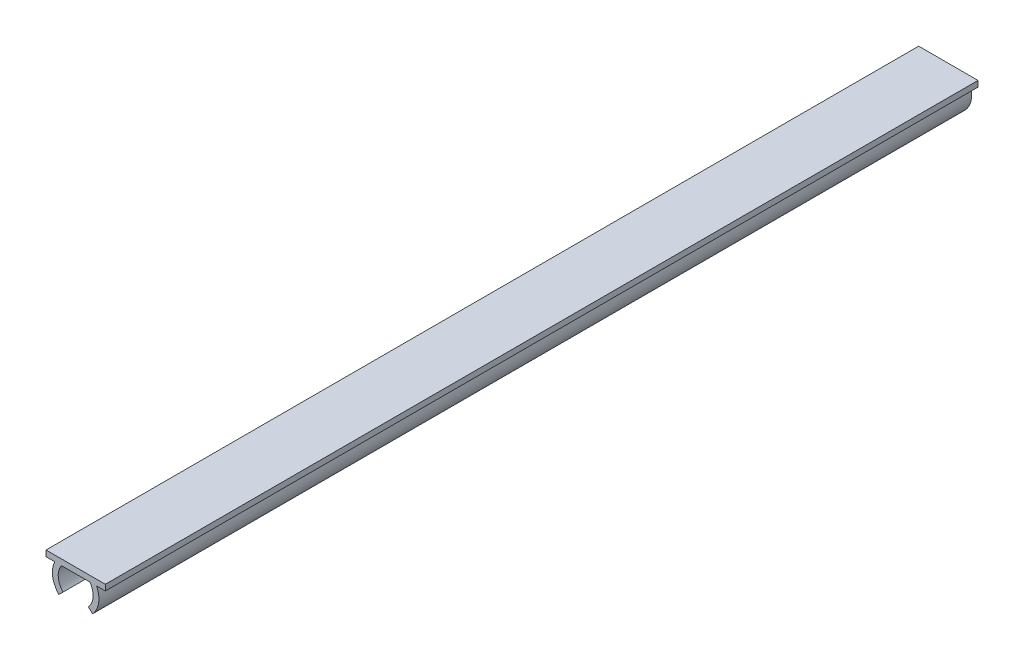
ISO-10303-21;
HEADER;
FILE_DESCRIPTION(('STEP AP214'),'2;1');
FILE_NAME('part.step','',(''),(''),'','','');
FILE_SCHEMA(('AUTOMOTIVE_DESIGN { 1 0 10303 214 1 1 1 1 }'));
ENDSEC;
DATA;
#1=APPLICATION_CONTEXT('core data for automotive mechanical design processes');
#2=APPLICATION_PROTOCOL_DEFINITION('international standard','automotive_design',2000,#1);
#3=PRODUCT_CONTEXT('',#1,'mechanical');
#4=PRODUCT('Part','Part','',(#3));
#5=PRODUCT_RELATED_PRODUCT_CATEGORY('part','',(#4));
#6=PRODUCT_DEFINITION_FORMATION('','',#4);
#7=PRODUCT_DEFINITION_CONTEXT('part definition',#1,'design');
#8=PRODUCT_DEFINITION('design','',#6,#7);
#9=PRODUCT_DEFINITION_SHAPE('','',#8);
#10=(LENGTH_UNIT() NAMED_UNIT(*) SI_UNIT(.MILLI.,.METRE.));
#11=(NAMED_UNIT(*) PLANE_ANGLE_UNIT() SI_UNIT($,.RADIAN.));
#12=(NAMED_UNIT(*) SI_UNIT($,.STERADIAN.) SOLID_ANGLE_UNIT());
#13=UNCERTAINTY_MEASURE_WITH_UNIT(LENGTH_MEASURE(1.E-05),#10,'distance_accuracy_value','');
#14=(GEOMETRIC_REPRESENTATION_CONTEXT(3) GLOBAL_UNCERTAINTY_ASSIGNED_CONTEXT((#13)) GLOBAL_UNIT_ASSIGNED_CONTEXT((#10,
#11,#12)) REPRESENTATION_CONTEXT('',''));
#15=CARTESIAN_POINT('',(0.,0.,0.));
#16=DIRECTION('',(0.,0.,1.));
#17=DIRECTION('',(1.,0.,0.));
#18=AXIS2_PLACEMENT_3D('',#15,#16,#17);
#19=CARTESIAN_POINT('',(-5.52857002796558,2.46154854229713,150.));
#20=DIRECTION('',(1.,0.,0.));
#21=DIRECTION('',(0.,0.,-1.));
#22=AXIS2_PLACEMENT_3D('',#19,#20,#21);
#23=PLANE('',#22);
#24=DIRECTION('',(0.,-1.,0.));
#25=VECTOR('',#24,1.);
#26=CARTESIAN_POINT('',(-5.52857002796558,2.46154854229713,0.));
#27=LINE('',#26,#25);
#28=CARTESIAN_POINT('',(-5.52857002796558,2.46154854229713,0.));
#29=VERTEX_POINT('',#28);
#30=CARTESIAN_POINT('',(-5.52857002796558,1.46154854229713,0.));
#31=VERTEX_POINT('',#30);
#32=EDGE_CURVE('E151',#29,#31,#27,.T.);
#33=ORIENTED_EDGE('',*,*,#32,.T.);
#34=DIRECTION('',(0.,0.,-1.));
#35=VECTOR('',#34,1.);
#36=CARTESIAN_POINT('',(-5.52857002796558,1.46154854229713,150.));
#37=LINE('',#36,#35);
#38=CARTESIAN_POINT('',(-5.52857002796558,1.46154854229713,150.));
#39=VERTEX_POINT('',#38);
#40=EDGE_CURVE('E11',#39,#31,#37,.T.);
#41=ORIENTED_EDGE('',*,*,#40,.F.);
#42=DIRECTION('',(0.,-1.,0.));
#43=VECTOR('',#42,1.);
#44=CARTESIAN_POINT('',(-5.52857002796558,2.46154854229713,150.));
#45=LINE('',#44,#43);
#46=CARTESIAN_POINT('',(-5.52857002796558,2.46154854229713,150.));
#47=VERTEX_POINT('',#46);
#48=EDGE_CURVE('E173',#47,#39,#45,.T.);
#49=ORIENTED_EDGE('',*,*,#48,.F.);
#50=DIRECTION('',(0.,0.,-1.));
#51=VECTOR('',#50,1.);
#52=CARTESIAN_POINT('',(-5.52857002796558,2.46154854229713,150.));
#53=LINE('',#52,#51);
#54=EDGE_CURVE('E147',#47,#29,#53,.T.);
#55=ORIENTED_EDGE('',*,*,#54,.T.);
#56=EDGE_LOOP('',(#33,#41,#49,#55));
#57=FACE_BOUND('',#56,.T.);
#58=ADVANCED_FACE('F31',(#57),#23,.F.);
#59=CARTESIAN_POINT('',(-5.52857002796558,1.46154854229713,150.));
#60=DIRECTION('',(0.,1.,0.));
#61=DIRECTION('',(0.,0.,1.));
#62=AXIS2_PLACEMENT_3D('',#59,#60,#61);
#63=PLANE('',#62);
#64=DIRECTION('',(1.,0.,0.));
#65=VECTOR('',#64,1.);
#66=CARTESIAN_POINT('',(-5.52857002796558,1.46154854229713,0.));
#67=LINE('',#66,#65);
#68=CARTESIAN_POINT('',(-4.02544367044997,1.46154854229712,0.));
#69=VERTEX_POINT('',#68);
#70=EDGE_CURVE('E154',#31,#69,#67,.T.);
#71=ORIENTED_EDGE('',*,*,#70,.T.);
#72=DIRECTION('',(0.,0.,-1.));
#73=VECTOR('',#72,1.);
#74=CARTESIAN_POINT('',(-4.02544367044997,1.46154854229712,150.));
#75=LINE('',#74,#73);
#76=CARTESIAN_POINT('',(-4.02544367044997,1.46154854229712,150.));
#77=VERTEX_POINT('',#76);
#78=EDGE_CURVE('E39',#77,#69,#75,.T.);
#79=ORIENTED_EDGE('',*,*,#78,.F.);
#80=DIRECTION('',(1.,0.,0.));
#81=VECTOR('',#80,1.);
#82=CARTESIAN_POINT('',(-5.52857002796558,1.46154854229713,150.));
#83=LINE('',#82,#81);
#84=EDGE_CURVE('E102',#39,#77,#83,.T.);
#85=ORIENTED_EDGE('',*,*,#84,.F.);
#86=ORIENTED_EDGE('',*,*,#40,.T.);
#87=EDGE_LOOP('',(#71,#79,#85,#86));
#88=FACE_BOUND('',#87,.T.);
#89=ADVANCED_FACE('F251',(#88),#63,.F.);
#90=CARTESIAN_POINT('',(-0.428570027965258,-0.288451457702843,150.));
#91=DIRECTION('',(0.,0.,-1.));
#92=DIRECTION('',(-1.,0.,0.));
#93=AXIS2_PLACEMENT_3D('',#90,#91,#92);
#94=CYLINDRICAL_SURFACE('',#93,4.00000000000014);
#95=CARTESIAN_POINT('',(-0.428570027965258,-0.288451457702843,0.));
#96=DIRECTION('',(0.,0.,1.));
#97=DIRECTION('',(1.,0.,0.));
#98=AXIS2_PLACEMENT_3D('',#95,#96,#97);
#99=CIRCLE('',#98,4.00000000000014);
#100=CARTESIAN_POINT('',(-3.33330753762096,-3.03845145770287,0.));
#101=VERTEX_POINT('',#100);
#102=EDGE_CURVE('E156',#69,#101,#99,.T.);
#103=ORIENTED_EDGE('',*,*,#102,.T.);
#104=DIRECTION('',(0.,0.,-1.));
#105=VECTOR('',#104,1.);
#106=CARTESIAN_POINT('',(-3.33330753762096,-3.03845145770287,150.));
#107=LINE('',#106,#105);
#108=CARTESIAN_POINT('',(-3.33330753762096,-3.03845145770287,150.));
#109=VERTEX_POINT('',#108);
#110=EDGE_CURVE('E192',#109,#101,#107,.T.);
#111=ORIENTED_EDGE('',*,*,#110,.F.);
#112=CARTESIAN_POINT('',(-0.428570027965258,-0.288451457702843,150.));
#113=DIRECTION('',(0.,0.,1.));
#114=DIRECTION('',(1.,0.,0.));
#115=AXIS2_PLACEMENT_3D('',#112,#113,#114);
#116=CIRCLE('',#115,4.00000000000014);
#117=EDGE_CURVE('E200',#77,#109,#116,.T.);
#118=ORIENTED_EDGE('',*,*,#117,.F.);
#119=ORIENTED_EDGE('',*,*,#78,.T.);
#120=EDGE_LOOP('',(#103,#111,#118,#119));
#121=FACE_BOUND('',#120,.T.);
#122=ADVANCED_FACE('F198',(#121),#94,.T.);
#123=CARTESIAN_POINT('',(-3.33330753762096,-3.03845145770287,150.));
#124=DIRECTION('',(-0.68750000000003,0.726184377413862,0.));
#125=DIRECTION('',(-0.726184377413862,-0.68750000000003,0.));
#126=AXIS2_PLACEMENT_3D('',#123,#124,#125);
#127=PLANE('',#126);
#128=DIRECTION('',(0.726184377413862,0.68750000000003,0.));
#129=VECTOR('',#128,1.);
#130=CARTESIAN_POINT('',(-3.33330753762096,-3.03845145770287,0.));
#131=LINE('',#130,#129);
#132=CARTESIAN_POINT('',(-2.60712316020718,-2.35095145770292,0.));
#133=VERTEX_POINT('',#132);
#134=EDGE_CURVE('E158',#101,#133,#131,.T.);
#135=ORIENTED_EDGE('',*,*,#134,.T.);
#136=DIRECTION('',(0.,0.,-1.));
#137=VECTOR('',#136,1.);
#138=CARTESIAN_POINT('',(-2.60712316020718,-2.35095145770292,150.));
#139=LINE('',#138,#137);
#140=CARTESIAN_POINT('',(-2.60712316020718,-2.35095145770292,150.));
#141=VERTEX_POINT('',#140);
#142=EDGE_CURVE('E189',#141,#133,#139,.T.);
#143=ORIENTED_EDGE('',*,*,#142,.F.);
#144=DIRECTION('',(0.726184377413862,0.68750000000003,0.));
#145=VECTOR('',#144,1.);
#146=CARTESIAN_POINT('',(-3.33330753762096,-3.03845145770287,150.));
#147=LINE('',#146,#145);
#148=EDGE_CURVE('E218',#109,#141,#147,.T.);
#149=ORIENTED_EDGE('',*,*,#148,.F.);
#150=ORIENTED_EDGE('',*,*,#110,.T.);
#151=EDGE_LOOP('',(#135,#143,#149,#150));
#152=FACE_BOUND('',#151,.T.);
#153=ADVANCED_FACE('F209',(#152),#127,.F.);
#154=CARTESIAN_POINT('',(-0.428570027965258,-0.288451457702843,150.));
#155=DIRECTION('',(0.,0.,-1.));
#156=DIRECTION('',(-1.,0.,0.));
#157=AXIS2_PLACEMENT_3D('',#154,#155,#156);
#158=CYLINDRICAL_SURFACE('',#157,3.00000000000023);
#159=CARTESIAN_POINT('',(-0.428570027965258,-0.288451457702843,0.));
#160=DIRECTION('',(0.,0.,-1.));
#161=DIRECTION('',(1.,0.,0.));
#162=AXIS2_PLACEMENT_3D('',#159,#160,#161);
#163=CIRCLE('',#162,3.00000000000023);
#164=CARTESIAN_POINT('',(-2.8652686141678,1.46154854229719,0.));
#165=VERTEX_POINT('',#164);
#166=EDGE_CURVE('E160',#133,#165,#163,.T.);
#167=ORIENTED_EDGE('',*,*,#166,.T.);
#168=DIRECTION('',(0.,0.,-1.));
#169=VECTOR('',#168,1.);
#170=CARTESIAN_POINT('',(-2.8652686141678,1.46154854229719,150.));
#171=LINE('',#170,#169);
#172=CARTESIAN_POINT('',(-2.8652686141678,1.46154854229719,150.));
#173=VERTEX_POINT('',#172);
#174=EDGE_CURVE('E186',#173,#165,#171,.T.);
#175=ORIENTED_EDGE('',*,*,#174,.F.);
#176=CARTESIAN_POINT('',(-0.428570027965258,-0.288451457702843,150.));
#177=DIRECTION('',(0.,0.,-1.));
#178=DIRECTION('',(1.,0.,0.));
#179=AXIS2_PLACEMENT_3D('',#176,#177,#178);
#180=CIRCLE('',#179,3.00000000000023);
#181=EDGE_CURVE('E215',#141,#173,#180,.T.);
#182=ORIENTED_EDGE('',*,*,#181,.F.);
#183=ORIENTED_EDGE('',*,*,#142,.T.);
#184=EDGE_LOOP('',(#167,#175,#182,#183));
#185=FACE_BOUND('',#184,.T.);
#186=ADVANCED_FACE('F213',(#185),#158,.F.);
#187=CARTESIAN_POINT('',(-2.8652686141678,1.46154854229719,150.));
#188=DIRECTION('',(0.,1.,0.));
#189=DIRECTION('',(0.,0.,1.));
#190=AXIS2_PLACEMENT_3D('',#187,#188,#189);
#191=PLANE('',#190);
#192=DIRECTION('',(1.,0.,0.));
#193=VECTOR('',#192,1.);
#194=CARTESIAN_POINT('',(-2.8652686141678,1.46154854229719,0.));
#195=LINE('',#194,#193);
#196=CARTESIAN_POINT('',(2.0081285582371,1.46154854229713,0.));
#197=VERTEX_POINT('',#196);
#198=EDGE_CURVE('E162',#165,#197,#195,.T.);
#199=ORIENTED_EDGE('',*,*,#198,.T.);
#200=DIRECTION('',(0.,0.,-1.));
#201=VECTOR('',#200,1.);
#202=CARTESIAN_POINT('',(2.0081285582371,1.46154854229713,150.));
#203=LINE('',#202,#201);
#204=CARTESIAN_POINT('',(2.0081285582371,1.46154854229713,150.));
#205=VERTEX_POINT('',#204);
#206=EDGE_CURVE('E183',#205,#197,#203,.T.);
#207=ORIENTED_EDGE('',*,*,#206,.F.);
#208=DIRECTION('',(1.,0.,0.));
#209=VECTOR('',#208,1.);
#210=CARTESIAN_POINT('',(-2.8652686141678,1.46154854229719,150.));
#211=LINE('',#210,#209);
#212=EDGE_CURVE('E217',#173,#205,#211,.T.);
#213=ORIENTED_EDGE('',*,*,#212,.F.);
#214=ORIENTED_EDGE('',*,*,#174,.T.);
#215=EDGE_LOOP('',(#199,#207,#213,#214));
#216=FACE_BOUND('',#215,.T.);
#217=ADVANCED_FACE('F264',(#216),#191,.F.);
#218=CARTESIAN_POINT('',(-0.428570027965258,-0.288451457702843,150.));
#219=DIRECTION('',(0.,0.,-1.));
#220=DIRECTION('',(-1.,0.,0.));
#221=AXIS2_PLACEMENT_3D('',#218,#219,#220);
#222=CYLINDRICAL_SURFACE('',#221,3.00000000000008);
#223=CARTESIAN_POINT('',(-0.428570027965258,-0.288451457702843,0.));
#224=DIRECTION('',(0.,0.,-1.));
#225=DIRECTION('',(1.,0.,0.));
#226=AXIS2_PLACEMENT_3D('',#223,#224,#225);
#227=CIRCLE('',#226,3.00000000000008);
#228=CARTESIAN_POINT('',(1.74998310427643,-2.35095145770281,0.));
#229=VERTEX_POINT('',#228);
#230=EDGE_CURVE('E164',#197,#229,#227,.T.);
#231=ORIENTED_EDGE('',*,*,#230,.T.);
#232=DIRECTION('',(0.,0.,-1.));
#233=VECTOR('',#232,1.);
#234=CARTESIAN_POINT('',(1.74998310427643,-2.35095145770281,150.));
#235=LINE('',#234,#233);
#236=CARTESIAN_POINT('',(1.74998310427643,-2.35095145770281,150.));
#237=VERTEX_POINT('',#236);
#238=EDGE_CURVE('E180',#237,#229,#235,.T.);
#239=ORIENTED_EDGE('',*,*,#238,.F.);
#240=CARTESIAN_POINT('',(-0.428570027965258,-0.288451457702843,150.));
#241=DIRECTION('',(0.,0.,-1.));
#242=DIRECTION('',(1.,0.,0.));
#243=AXIS2_PLACEMENT_3D('',#240,#241,#242);
#244=CIRCLE('',#243,3.00000000000008);
#245=EDGE_CURVE('E220',#205,#237,#244,.T.);
#246=ORIENTED_EDGE('',*,*,#245,.F.);
#247=ORIENTED_EDGE('',*,*,#206,.T.);
#248=EDGE_LOOP('',(#231,#239,#246,#247));
#249=FACE_BOUND('',#248,.T.);
#250=ADVANCED_FACE('F267',(#249),#222,.F.);
#251=CARTESIAN_POINT('',(1.74998310427643,-2.35095145770281,150.));
#252=DIRECTION('',(0.68750000000003,0.726184377413862,0.));
#253=DIRECTION('',(-0.726184377413862,0.68750000000003,0.));
#254=AXIS2_PLACEMENT_3D('',#251,#252,#253);
#255=PLANE('',#254);
#256=DIRECTION('',(0.726184377413862,-0.68750000000003,0.));
#257=VECTOR('',#256,1.);
#258=CARTESIAN_POINT('',(1.74998310427643,-2.35095145770281,0.));
#259=LINE('',#258,#257);
#260=CARTESIAN_POINT('',(2.47616748169038,-3.03845145770292,0.));
#261=VERTEX_POINT('',#260);
#262=EDGE_CURVE('E166',#229,#261,#259,.T.);
#263=ORIENTED_EDGE('',*,*,#262,.T.);
#264=DIRECTION('',(0.,0.,-1.));
#265=VECTOR('',#264,1.);
#266=CARTESIAN_POINT('',(2.47616748169038,-3.03845145770292,150.));
#267=LINE('',#266,#265);
#268=CARTESIAN_POINT('',(2.47616748169038,-3.03845145770292,150.));
#269=VERTEX_POINT('',#268);
#270=EDGE_CURVE('E177',#269,#261,#267,.T.);
#271=ORIENTED_EDGE('',*,*,#270,.F.);
#272=DIRECTION('',(0.726184377413862,-0.68750000000003,0.));
#273=VECTOR('',#272,1.);
#274=CARTESIAN_POINT('',(1.74998310427643,-2.35095145770281,150.));
#275=LINE('',#274,#273);
#276=EDGE_CURVE('E226',#237,#269,#275,.T.);
#277=ORIENTED_EDGE('',*,*,#276,.F.);
#278=ORIENTED_EDGE('',*,*,#238,.T.);
#279=EDGE_LOOP('',(#263,#271,#277,#278));
#280=FACE_BOUND('',#279,.T.);
#281=ADVANCED_FACE('F232',(#280),#255,.F.);
#282=CARTESIAN_POINT('',(-0.428570027965258,-0.288451457702843,150.));
#283=DIRECTION('',(0.,0.,-1.));
#284=DIRECTION('',(-1.,0.,0.));
#285=AXIS2_PLACEMENT_3D('',#282,#283,#284);
#286=CYLINDRICAL_SURFACE('',#285,4.00000000000011);
#287=CARTESIAN_POINT('',(-0.428570027965258,-0.288451457702843,0.));
#288=DIRECTION('',(0.,0.,1.));
#289=DIRECTION('',(1.,0.,0.));
#290=AXIS2_PLACEMENT_3D('',#287,#288,#289);
#291=CIRCLE('',#290,4.00000000000011);
#292=CARTESIAN_POINT('',(3.16830361451947,1.46154854229719,0.));
#293=VERTEX_POINT('',#292);
#294=EDGE_CURVE('E168',#261,#293,#291,.T.);
#295=ORIENTED_EDGE('',*,*,#294,.T.);
#296=DIRECTION('',(0.,0.,-1.));
#297=VECTOR('',#296,1.);
#298=CARTESIAN_POINT('',(3.16830361451947,1.46154854229719,150.));
#299=LINE('',#298,#297);
#300=CARTESIAN_POINT('',(3.16830361451947,1.46154854229719,150.));
#301=VERTEX_POINT('',#300);
#302=EDGE_CURVE('E142',#301,#293,#299,.T.);
#303=ORIENTED_EDGE('',*,*,#302,.F.);
#304=CARTESIAN_POINT('',(-0.428570027965258,-0.288451457702843,150.));
#305=DIRECTION('',(0.,0.,1.));
#306=DIRECTION('',(1.,0.,0.));
#307=AXIS2_PLACEMENT_3D('',#304,#305,#306);
#308=CIRCLE('',#307,4.00000000000011);
#309=EDGE_CURVE('E133',#269,#301,#308,.T.);
#310=ORIENTED_EDGE('',*,*,#309,.F.);
#311=ORIENTED_EDGE('',*,*,#270,.T.);
#312=EDGE_LOOP('',(#295,#303,#310,#311));
#313=FACE_BOUND('',#312,.T.);
#314=ADVANCED_FACE('F236',(#313),#286,.T.);
#315=CARTESIAN_POINT('',(3.16830361451947,1.46154854229719,150.));
#316=DIRECTION('',(0.,1.,0.));
#317=DIRECTION('',(0.,0.,1.));
#318=AXIS2_PLACEMENT_3D('',#315,#316,#317);
#319=PLANE('',#318);
#320=DIRECTION('',(1.,0.,0.));
#321=VECTOR('',#320,1.);
#322=CARTESIAN_POINT('',(3.16830361451947,1.46154854229719,0.));
#323=LINE('',#322,#321);
#324=CARTESIAN_POINT('',(4.67142997203418,1.46154854229719,0.));
#325=VERTEX_POINT('',#324);
#326=EDGE_CURVE('E141',#293,#325,#323,.T.);
#327=ORIENTED_EDGE('',*,*,#326,.T.);
#328=DIRECTION('',(0.,0.,-1.));
#329=VECTOR('',#328,1.);
#330=CARTESIAN_POINT('',(4.67142997203418,1.46154854229719,150.));
#331=LINE('',#330,#329);
#332=CARTESIAN_POINT('',(4.67142997203418,1.46154854229719,150.));
#333=VERTEX_POINT('',#332);
#334=EDGE_CURVE('E138',#333,#325,#331,.T.);
#335=ORIENTED_EDGE('',*,*,#334,.F.);
#336=DIRECTION('',(1.,0.,0.));
#337=VECTOR('',#336,1.);
#338=CARTESIAN_POINT('',(3.16830361451947,1.46154854229719,150.));
#339=LINE('',#338,#337);
#340=EDGE_CURVE('E127',#301,#333,#339,.T.);
#341=ORIENTED_EDGE('',*,*,#340,.F.);
#342=ORIENTED_EDGE('',*,*,#302,.T.);
#343=EDGE_LOOP('',(#327,#335,#341,#342));
#344=FACE_BOUND('',#343,.T.);
#345=ADVANCED_FACE('F139',(#344),#319,.F.);
#346=CARTESIAN_POINT('',(4.67142997203418,2.46154854229719,150.));
#347=DIRECTION('',(-1.,0.,0.));
#348=DIRECTION('',(0.,0.,1.));
#349=AXIS2_PLACEMENT_3D('',#346,#347,#348);
#350=PLANE('',#349);
#351=DIRECTION('',(0.,1.,0.));
#352=VECTOR('',#351,1.);
#353=CARTESIAN_POINT('',(4.67142997203418,2.46154854229719,0.));
#354=LINE('',#353,#352);
#355=CARTESIAN_POINT('',(4.67142997203418,2.46154854229719,0.));
#356=VERTEX_POINT('',#355);
#357=EDGE_CURVE('E88',#325,#356,#354,.T.);
#358=ORIENTED_EDGE('',*,*,#357,.T.);
#359=DIRECTION('',(0.,0.,-1.));
#360=VECTOR('',#359,1.);
#361=CARTESIAN_POINT('',(4.67142997203418,2.46154854229719,150.));
#362=LINE('',#361,#360);
#363=CARTESIAN_POINT('',(4.67142997203418,2.46154854229719,150.));
#364=VERTEX_POINT('',#363);
#365=EDGE_CURVE('E143',#364,#356,#362,.T.);
#366=ORIENTED_EDGE('',*,*,#365,.F.);
#367=DIRECTION('',(0.,1.,0.));
#368=VECTOR('',#367,1.);
#369=CARTESIAN_POINT('',(4.67142997203418,2.46154854229719,150.));
#370=LINE('',#369,#368);
#371=EDGE_CURVE('E131',#333,#364,#370,.T.);
#372=ORIENTED_EDGE('',*,*,#371,.F.);
#373=ORIENTED_EDGE('',*,*,#334,.T.);
#374=EDGE_LOOP('',(#358,#366,#372,#373));
#375=FACE_BOUND('',#374,.T.);
#376=ADVANCED_FACE('F145',(#375),#350,.F.);
#377=CARTESIAN_POINT('',(-5.52857002796558,2.46154854229713,150.));
#378=DIRECTION('',(0.,-1.,0.));
#379=DIRECTION('',(1.,0.,0.));
#380=AXIS2_PLACEMENT_3D('',#377,#378,#379);
#381=PLANE('',#380);
#382=DIRECTION('',(-1.,0.,0.));
#383=VECTOR('',#382,1.);
#384=CARTESIAN_POINT('',(-5.52857002796558,2.46154854229713,0.));
#385=LINE('',#384,#383);
#386=EDGE_CURVE('E94',#356,#29,#385,.T.);
#387=ORIENTED_EDGE('',*,*,#386,.T.);
#388=ORIENTED_EDGE('',*,*,#54,.F.);
#389=DIRECTION('',(-1.,0.,0.));
#390=VECTOR('',#389,1.);
#391=CARTESIAN_POINT('',(-5.52857002796558,2.46154854229713,150.));
#392=LINE('',#391,#390);
#393=EDGE_CURVE('E47',#364,#47,#392,.T.);
#394=ORIENTED_EDGE('',*,*,#393,.F.);
#395=ORIENTED_EDGE('',*,*,#365,.T.);
#396=EDGE_LOOP('',(#387,#388,#394,#395));
#397=FACE_BOUND('',#396,.T.);
#398=ADVANCED_FACE('F240',(#397),#381,.F.);
#399=CARTESIAN_POINT('',(-0.428570027965258,-0.288451457702843,150.));
#400=DIRECTION('',(0.,0.,1.));
#401=DIRECTION('',(1.,0.,0.));
#402=AXIS2_PLACEMENT_3D('',#399,#400,#401);
#403=PLANE('',#402);
#404=ORIENTED_EDGE('',*,*,#48,.T.);
#405=ORIENTED_EDGE('',*,*,#84,.T.);
#406=ORIENTED_EDGE('',*,*,#117,.T.);
#407=ORIENTED_EDGE('',*,*,#148,.T.);
#408=ORIENTED_EDGE('',*,*,#181,.T.);
#409=ORIENTED_EDGE('',*,*,#212,.T.);
#410=ORIENTED_EDGE('',*,*,#245,.T.);
#411=ORIENTED_EDGE('',*,*,#276,.T.);
#412=ORIENTED_EDGE('',*,*,#309,.T.);
#413=ORIENTED_EDGE('',*,*,#340,.T.);
#414=ORIENTED_EDGE('',*,*,#371,.T.);
#415=ORIENTED_EDGE('',*,*,#393,.T.);
#416=EDGE_LOOP('',(#404,#405,#406,#407,#408,#409,#410,#411,#412,#413,#414,#415));
#417=FACE_BOUND('',#416,.T.);
#418=ADVANCED_FACE('F129',(#417),#403,.T.);
#419=CARTESIAN_POINT('',(-0.428570027965258,-0.288451457702843,0.));
#420=DIRECTION('',(0.,0.,1.));
#421=DIRECTION('',(1.,0.,0.));
#422=AXIS2_PLACEMENT_3D('',#419,#420,#421);
#423=PLANE('',#422);
#424=ORIENTED_EDGE('',*,*,#32,.F.);
#425=ORIENTED_EDGE('',*,*,#386,.F.);
#426=ORIENTED_EDGE('',*,*,#357,.F.);
#427=ORIENTED_EDGE('',*,*,#326,.F.);
#428=ORIENTED_EDGE('',*,*,#294,.F.);
#429=ORIENTED_EDGE('',*,*,#262,.F.);
#430=ORIENTED_EDGE('',*,*,#230,.F.);
#431=ORIENTED_EDGE('',*,*,#198,.F.);
#432=ORIENTED_EDGE('',*,*,#166,.F.);
#433=ORIENTED_EDGE('',*,*,#134,.F.);
#434=ORIENTED_EDGE('',*,*,#102,.F.);
#435=ORIENTED_EDGE('',*,*,#70,.F.);
#436=EDGE_LOOP('',(#424,#425,#426,#427,#428,#429,#430,#431,#432,#433,#434,#435));
#437=FACE_BOUND('',#436,.T.);
#438=ADVANCED_FACE('F204',(#437),#423,.F.);
#439=CLOSED_SHELL('',(#58,#89,#122,#153,#186,#217,#250,#281,#314,#345,#376,#398,#418,#438));
#440=MANIFOLD_SOLID_BREP('B2',#439);
#441=ADVANCED_BREP_SHAPE_REPRESENTATION('',(#18,#440),#14);
#442=SHAPE_DEFINITION_REPRESENTATION(#9,#441);
ENDSEC;
END-ISO-10303-21;
